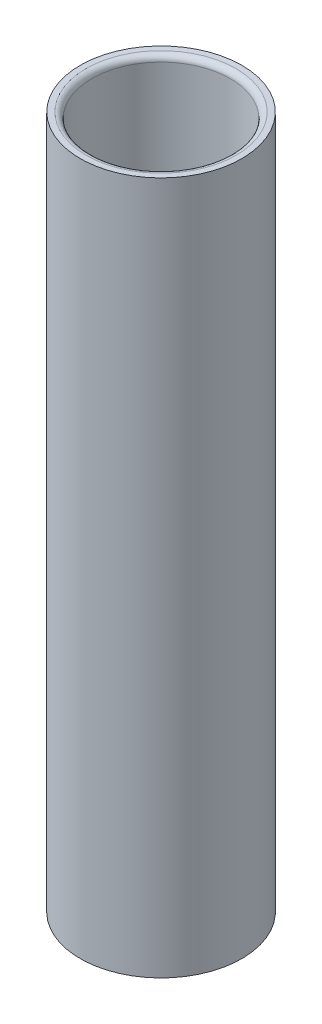
ISO-10303-21;
HEADER;
FILE_DESCRIPTION(('STEP AP214'),'2;1');
FILE_NAME('part.step','',(''),(''),'','','');
FILE_SCHEMA(('AUTOMOTIVE_DESIGN { 1 0 10303 214 1 1 1 1 }'));
ENDSEC;
DATA;
#1=APPLICATION_CONTEXT('core data for automotive mechanical design processes');
#2=APPLICATION_PROTOCOL_DEFINITION('international standard','automotive_design',2000,#1);
#3=PRODUCT_CONTEXT('',#1,'mechanical');
#4=PRODUCT('Part','Part','',(#3));
#5=PRODUCT_RELATED_PRODUCT_CATEGORY('part','',(#4));
#6=PRODUCT_DEFINITION_FORMATION('','',#4);
#7=PRODUCT_DEFINITION_CONTEXT('part definition',#1,'design');
#8=PRODUCT_DEFINITION('design','',#6,#7);
#9=PRODUCT_DEFINITION_SHAPE('','',#8);
#10=(LENGTH_UNIT() NAMED_UNIT(*) SI_UNIT(.MILLI.,.METRE.));
#11=(NAMED_UNIT(*) PLANE_ANGLE_UNIT() SI_UNIT($,.RADIAN.));
#12=(NAMED_UNIT(*) SI_UNIT($,.STERADIAN.) SOLID_ANGLE_UNIT());
#13=UNCERTAINTY_MEASURE_WITH_UNIT(LENGTH_MEASURE(1.E-05),#10,'distance_accuracy_value','');
#14=(GEOMETRIC_REPRESENTATION_CONTEXT(3) GLOBAL_UNCERTAINTY_ASSIGNED_CONTEXT((#13)) GLOBAL_UNIT_ASSIGNED_CONTEXT((#10,
#11,#12)) REPRESENTATION_CONTEXT('',''));
#15=CARTESIAN_POINT('',(0.,0.,0.));
#16=DIRECTION('',(0.,0.,1.));
#17=DIRECTION('',(1.,0.,0.));
#18=AXIS2_PLACEMENT_3D('',#15,#16,#17);
#19=CARTESIAN_POINT('',(0.,30.,0.));
#20=DIRECTION('',(0.,-1.,0.));
#21=DIRECTION('',(0.,0.,-1.));
#22=AXIS2_PLACEMENT_3D('',#19,#20,#21);
#23=CYLINDRICAL_SURFACE('',#22,3.);
#24=CARTESIAN_POINT('',(0.,29.75,0.));
#25=DIRECTION('',(0.,1.,0.));
#26=DIRECTION('',(0.,0.,1.));
#27=AXIS2_PLACEMENT_3D('',#24,#25,#26);
#28=CIRCLE('',#27,3.);
#29=CARTESIAN_POINT('',(0.,29.75,3.));
#30=VERTEX_POINT('',#29);
#31=EDGE_CURVE('E115',#30,#30,#28,.F.);
#32=ORIENTED_EDGE('',*,*,#31,.F.);
#33=EDGE_LOOP('',(#32));
#34=FACE_BOUND('',#33,.T.);
#35=CARTESIAN_POINT('',(0.,0.25,0.));
#36=DIRECTION('',(0.,1.,0.));
#37=DIRECTION('',(0.,0.,1.));
#38=AXIS2_PLACEMENT_3D('',#35,#36,#37);
#39=CIRCLE('',#38,3.);
#40=CARTESIAN_POINT('',(0.,0.25,3.));
#41=VERTEX_POINT('',#40);
#42=EDGE_CURVE('E55',#41,#41,#39,.T.);
#43=ORIENTED_EDGE('',*,*,#42,.F.);
#44=EDGE_LOOP('',(#43));
#45=FACE_BOUND('',#44,.T.);
#46=ADVANCED_FACE('F17',(#34,#45),#23,.F.);
#47=CARTESIAN_POINT('',(0.,29.75,0.));
#48=DIRECTION('',(0.,1.,0.));
#49=DIRECTION('',(0.,0.,1.));
#50=AXIS2_PLACEMENT_3D('',#47,#48,#49);
#51=TOROIDAL_SURFACE('',#50,3.25,0.25);
#52=ORIENTED_EDGE('',*,*,#31,.T.);
#53=EDGE_LOOP('',(#52));
#54=FACE_BOUND('',#53,.T.);
#55=CARTESIAN_POINT('',(0.,30.,0.));
#56=DIRECTION('',(0.,1.,0.));
#57=DIRECTION('',(0.,0.,1.));
#58=AXIS2_PLACEMENT_3D('',#55,#56,#57);
#59=CIRCLE('',#58,3.25);
#60=CARTESIAN_POINT('',(0.,30.,-3.25));
#61=VERTEX_POINT('',#60);
#62=CARTESIAN_POINT('',(0.,30.,3.25));
#63=VERTEX_POINT('',#62);
#64=EDGE_CURVE('E46',#61,#63,#59,.F.);
#65=ORIENTED_EDGE('',*,*,#64,.F.);
#66=CARTESIAN_POINT('',(0.,30.,0.));
#67=DIRECTION('',(0.,1.,0.));
#68=DIRECTION('',(0.,0.,-1.));
#69=AXIS2_PLACEMENT_3D('',#66,#67,#68);
#70=CIRCLE('',#69,3.25);
#71=EDGE_CURVE('E44',#63,#61,#70,.F.);
#72=ORIENTED_EDGE('',*,*,#71,.F.);
#73=EDGE_LOOP('',(#65,#72));
#74=FACE_BOUND('',#73,.T.);
#75=ADVANCED_FACE('F48',(#54,#74),#51,.T.);
#76=CARTESIAN_POINT('',(0.,0.25,0.));
#77=DIRECTION('',(0.,1.,0.));
#78=DIRECTION('',(0.,0.,1.));
#79=AXIS2_PLACEMENT_3D('',#76,#77,#78);
#80=TOROIDAL_SURFACE('',#79,3.25,0.25);
#81=CARTESIAN_POINT('',(0.,0.,0.));
#82=DIRECTION('',(0.,-1.,0.));
#83=DIRECTION('',(0.,0.,1.));
#84=AXIS2_PLACEMENT_3D('',#81,#82,#83);
#85=CIRCLE('',#84,3.25);
#86=CARTESIAN_POINT('',(0.,0.,3.25));
#87=VERTEX_POINT('',#86);
#88=CARTESIAN_POINT('',(0.,0.,-3.25));
#89=VERTEX_POINT('',#88);
#90=EDGE_CURVE('E35',#87,#89,#85,.T.);
#91=ORIENTED_EDGE('',*,*,#90,.T.);
#92=CARTESIAN_POINT('',(0.,0.,0.));
#93=DIRECTION('',(0.,-1.,0.));
#94=DIRECTION('',(0.,0.,-1.));
#95=AXIS2_PLACEMENT_3D('',#92,#93,#94);
#96=CIRCLE('',#95,3.25);
#97=EDGE_CURVE('E92',#89,#87,#96,.T.);
#98=ORIENTED_EDGE('',*,*,#97,.T.);
#99=EDGE_LOOP('',(#91,#98));
#100=FACE_BOUND('',#99,.T.);
#101=ORIENTED_EDGE('',*,*,#42,.T.);
#102=EDGE_LOOP('',(#101));
#103=FACE_BOUND('',#102,.T.);
#104=ADVANCED_FACE('F75',(#100,#103),#80,.T.);
#105=CARTESIAN_POINT('',(0.,30.,0.));
#106=DIRECTION('',(0.,1.,0.));
#107=DIRECTION('',(0.,0.,1.));
#108=AXIS2_PLACEMENT_3D('',#105,#106,#107);
#109=PLANE('',#108);
#110=CARTESIAN_POINT('',(0.,30.,0.));
#111=DIRECTION('',(0.,-1.,0.));
#112=DIRECTION('',(0.,0.,-1.));
#113=AXIS2_PLACEMENT_3D('',#110,#111,#112);
#114=CIRCLE('',#113,3.5);
#115=CARTESIAN_POINT('',(0.,30.,-3.5));
#116=VERTEX_POINT('',#115);
#117=EDGE_CURVE('E27',#116,#116,#114,.T.);
#118=ORIENTED_EDGE('',*,*,#117,.F.);
#119=EDGE_LOOP('',(#118));
#120=FACE_BOUND('',#119,.T.);
#121=ORIENTED_EDGE('',*,*,#71,.T.);
#122=ORIENTED_EDGE('',*,*,#64,.T.);
#123=EDGE_LOOP('',(#121,#122));
#124=FACE_BOUND('',#123,.T.);
#125=ADVANCED_FACE('F54',(#120,#124),#109,.T.);
#126=CARTESIAN_POINT('',(0.,0.,0.));
#127=DIRECTION('',(0.,1.,0.));
#128=DIRECTION('',(0.,0.,1.));
#129=AXIS2_PLACEMENT_3D('',#126,#127,#128);
#130=PLANE('',#129);
#131=CARTESIAN_POINT('',(0.,0.,0.));
#132=DIRECTION('',(0.,-1.,0.));
#133=DIRECTION('',(0.,0.,-1.));
#134=AXIS2_PLACEMENT_3D('',#131,#132,#133);
#135=CIRCLE('',#134,3.5);
#136=CARTESIAN_POINT('',(0.,0.,-3.5));
#137=VERTEX_POINT('',#136);
#138=EDGE_CURVE('E10',#137,#137,#135,.F.);
#139=ORIENTED_EDGE('',*,*,#138,.F.);
#140=EDGE_LOOP('',(#139));
#141=FACE_BOUND('',#140,.T.);
#142=ORIENTED_EDGE('',*,*,#90,.F.);
#143=ORIENTED_EDGE('',*,*,#97,.F.);
#144=EDGE_LOOP('',(#142,#143));
#145=FACE_BOUND('',#144,.T.);
#146=ADVANCED_FACE('F74',(#141,#145),#130,.F.);
#147=CARTESIAN_POINT('',(0.,30.,0.));
#148=DIRECTION('',(0.,-1.,0.));
#149=DIRECTION('',(0.,0.,-1.));
#150=AXIS2_PLACEMENT_3D('',#147,#148,#149);
#151=CYLINDRICAL_SURFACE('',#150,3.5);
#152=ORIENTED_EDGE('',*,*,#138,.T.);
#153=EDGE_LOOP('',(#152));
#154=FACE_BOUND('',#153,.T.);
#155=ORIENTED_EDGE('',*,*,#117,.T.);
#156=EDGE_LOOP('',(#155));
#157=FACE_BOUND('',#156,.T.);
#158=ADVANCED_FACE('F129',(#154,#157),#151,.T.);
#159=CLOSED_SHELL('',(#46,#75,#104,#125,#146,#158));
#160=MANIFOLD_SOLID_BREP('B1',#159);
#161=ADVANCED_BREP_SHAPE_REPRESENTATION('',(#18,#160),#14);
#162=SHAPE_DEFINITION_REPRESENTATION(#9,#161);
ENDSEC;
END-ISO-10303-21;
